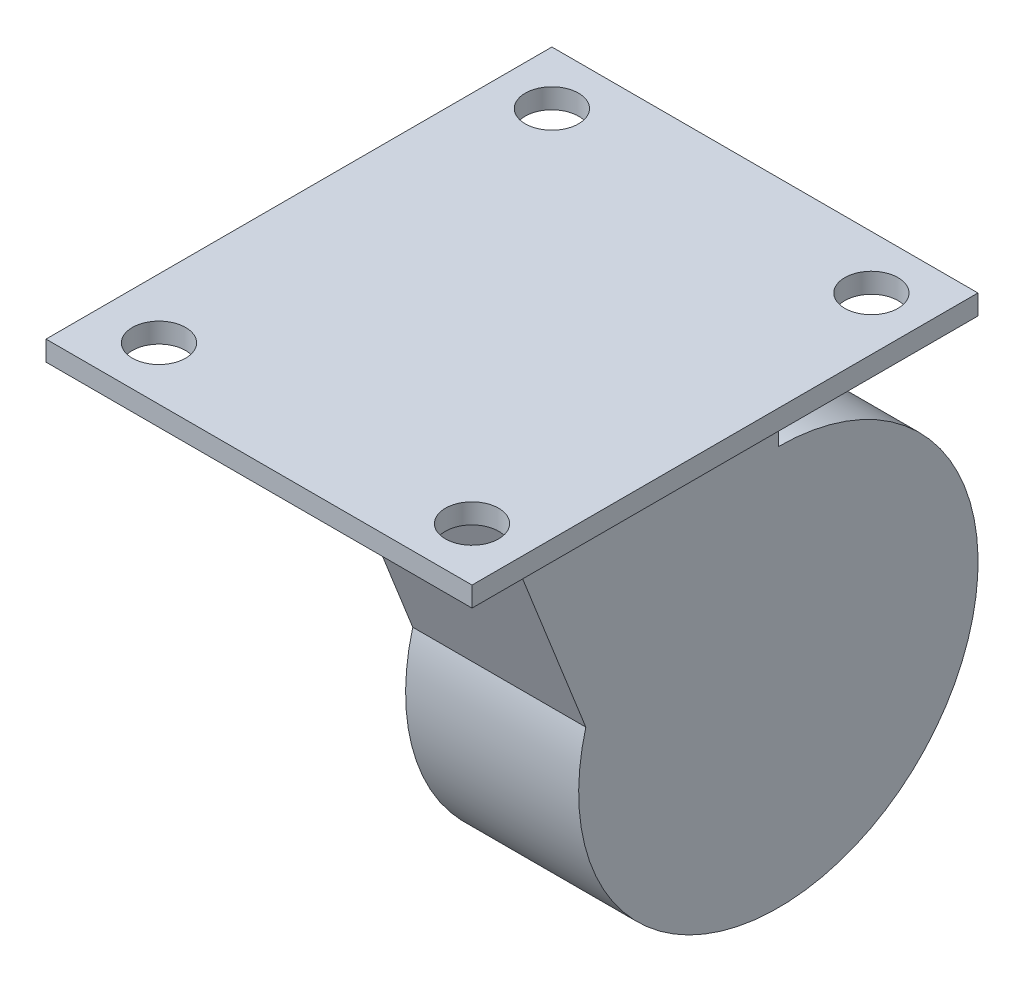
ISO-10303-21;
HEADER;
FILE_DESCRIPTION(('STEP AP214'),'2;1');
FILE_NAME('part.step','',(''),(''),'','','');
FILE_SCHEMA(('AUTOMOTIVE_DESIGN { 1 0 10303 214 1 1 1 1 }'));
ENDSEC;
DATA;
#1=APPLICATION_CONTEXT('core data for automotive mechanical design processes');
#2=APPLICATION_PROTOCOL_DEFINITION('international standard','automotive_design',2000,#1);
#3=PRODUCT_CONTEXT('',#1,'mechanical');
#4=PRODUCT('Part','Part','',(#3));
#5=PRODUCT_RELATED_PRODUCT_CATEGORY('part','',(#4));
#6=PRODUCT_DEFINITION_FORMATION('','',#4);
#7=PRODUCT_DEFINITION_CONTEXT('part definition',#1,'design');
#8=PRODUCT_DEFINITION('design','',#6,#7);
#9=PRODUCT_DEFINITION_SHAPE('','',#8);
#10=(LENGTH_UNIT() NAMED_UNIT(*) SI_UNIT(.MILLI.,.METRE.));
#11=(NAMED_UNIT(*) PLANE_ANGLE_UNIT() SI_UNIT($,.RADIAN.));
#12=(NAMED_UNIT(*) SI_UNIT($,.STERADIAN.) SOLID_ANGLE_UNIT());
#13=UNCERTAINTY_MEASURE_WITH_UNIT(LENGTH_MEASURE(1.E-05),#10,'distance_accuracy_value','');
#14=(GEOMETRIC_REPRESENTATION_CONTEXT(3) GLOBAL_UNCERTAINTY_ASSIGNED_CONTEXT((#13)) GLOBAL_UNIT_ASSIGNED_CONTEXT((#10,
#11,#12)) REPRESENTATION_CONTEXT('',''));
#15=CARTESIAN_POINT('',(0.,0.,0.));
#16=DIRECTION('',(0.,0.,1.));
#17=DIRECTION('',(1.,0.,0.));
#18=AXIS2_PLACEMENT_3D('',#15,#16,#17);
#19=CARTESIAN_POINT('',(0.,-1.5,0.));
#20=DIRECTION('',(0.,1.,0.));
#21=DIRECTION('',(0.,0.,1.));
#22=AXIS2_PLACEMENT_3D('',#19,#20,#21);
#23=PLANE('',#22);
#24=DIRECTION('',(0.,0.,1.));
#25=VECTOR('',#24,1.);
#26=CARTESIAN_POINT('',(-12.8229392993999,-1.5,-14.9558388081888));
#27=LINE('',#26,#25);
#28=CARTESIAN_POINT('',(-12.8229392993999,-1.5,-14.9558388081888));
#29=VERTEX_POINT('',#28);
#30=CARTESIAN_POINT('',(-12.8229392993999,-1.5,23.0441611918112));
#31=VERTEX_POINT('',#30);
#32=EDGE_CURVE('E171',#29,#31,#27,.T.);
#33=ORIENTED_EDGE('',*,*,#32,.F.);
#34=DIRECTION('',(-1.,0.,0.));
#35=VECTOR('',#34,1.);
#36=CARTESIAN_POINT('',(-12.8229392993999,-1.5,-14.9558388081888));
#37=LINE('',#36,#35);
#38=CARTESIAN_POINT('',(19.1770607006001,-1.5,-14.9558388081888));
#39=VERTEX_POINT('',#38);
#40=EDGE_CURVE('E179',#39,#29,#37,.T.);
#41=ORIENTED_EDGE('',*,*,#40,.F.);
#42=DIRECTION('',(0.,0.,-1.));
#43=VECTOR('',#42,1.);
#44=CARTESIAN_POINT('',(19.1770607006001,-1.5,-14.9558388081888));
#45=LINE('',#44,#43);
#46=CARTESIAN_POINT('',(19.1770607006001,-1.5,23.0441611918112));
#47=VERTEX_POINT('',#46);
#48=EDGE_CURVE('E176',#47,#39,#45,.T.);
#49=ORIENTED_EDGE('',*,*,#48,.F.);
#50=DIRECTION('',(1.,0.,0.));
#51=VECTOR('',#50,1.);
#52=CARTESIAN_POINT('',(-12.8229392993999,-1.5,23.0441611918112));
#53=LINE('',#52,#51);
#54=EDGE_CURVE('E173',#31,#47,#53,.T.);
#55=ORIENTED_EDGE('',*,*,#54,.F.);
#56=EDGE_LOOP('',(#33,#41,#49,#55));
#57=FACE_BOUND('',#56,.T.);
#58=CARTESIAN_POINT('',(-8.8229392993999,-1.5,-10.9558388081888));
#59=DIRECTION('',(0.,1.,0.));
#60=DIRECTION('',(0.,0.,1.));
#61=AXIS2_PLACEMENT_3D('',#58,#59,#60);
#62=CIRCLE('',#61,2.);
#63=CARTESIAN_POINT('',(-8.8229392993999,-1.5,-8.95583880818883));
#64=VERTEX_POINT('',#63);
#65=EDGE_CURVE('E165',#64,#64,#62,.T.);
#66=ORIENTED_EDGE('',*,*,#65,.T.);
#67=EDGE_LOOP('',(#66));
#68=FACE_BOUND('',#67,.T.);
#69=CARTESIAN_POINT('',(15.1770607006001,-1.5,-10.9558388081888));
#70=DIRECTION('',(0.,1.,0.));
#71=DIRECTION('',(0.,0.,1.));
#72=AXIS2_PLACEMENT_3D('',#69,#70,#71);
#73=CIRCLE('',#72,2.00000000000001);
#74=CARTESIAN_POINT('',(15.1770607006001,-1.5,-8.95583880818883));
#75=VERTEX_POINT('',#74);
#76=EDGE_CURVE('E159',#75,#75,#73,.T.);
#77=ORIENTED_EDGE('',*,*,#76,.T.);
#78=EDGE_LOOP('',(#77));
#79=FACE_BOUND('',#78,.T.);
#80=CARTESIAN_POINT('',(15.1770607006001,-1.5,19.0441611918112));
#81=DIRECTION('',(0.,1.,0.));
#82=DIRECTION('',(0.,0.,1.));
#83=AXIS2_PLACEMENT_3D('',#80,#81,#82);
#84=CIRCLE('',#83,2.00000000000001);
#85=CARTESIAN_POINT('',(15.1770607006001,-1.5,21.0441611918112));
#86=VERTEX_POINT('',#85);
#87=EDGE_CURVE('E153',#86,#86,#84,.T.);
#88=ORIENTED_EDGE('',*,*,#87,.T.);
#89=EDGE_LOOP('',(#88));
#90=FACE_BOUND('',#89,.T.);
#91=CARTESIAN_POINT('',(-8.33660745961774,-1.5,19.0441611918112));
#92=DIRECTION('',(0.,1.,0.));
#93=DIRECTION('',(0.,0.,1.));
#94=AXIS2_PLACEMENT_3D('',#91,#92,#93);
#95=CIRCLE('',#94,2.);
#96=CARTESIAN_POINT('',(-8.33660745961774,-1.5,21.0441611918112));
#97=VERTEX_POINT('',#96);
#98=EDGE_CURVE('E147',#97,#97,#95,.T.);
#99=ORIENTED_EDGE('',*,*,#98,.T.);
#100=EDGE_LOOP('',(#99));
#101=FACE_BOUND('',#100,.T.);
#102=DIRECTION('',(0.,0.,1.));
#103=VECTOR('',#102,1.);
#104=CARTESIAN_POINT('',(9.6770607006001,-1.5,0.));
#105=LINE('',#104,#103);
#106=CARTESIAN_POINT('',(9.6770607006001,-1.5,-9.46635307367223));
#107=VERTEX_POINT('',#106);
#108=CARTESIAN_POINT('',(9.6770607006001,-1.5,13.4942410044884));
#109=VERTEX_POINT('',#108);
#110=EDGE_CURVE('E136',#107,#109,#105,.T.);
#111=ORIENTED_EDGE('',*,*,#110,.F.);
#112=DIRECTION('',(-1.,0.,0.));
#113=VECTOR('',#112,1.);
#114=CARTESIAN_POINT('',(9.6770607006001,-1.5,-9.46635307367223));
#115=LINE('',#114,#113);
#116=CARTESIAN_POINT('',(-3.3229392993999,-1.5,-9.46635307367223));
#117=VERTEX_POINT('',#116);
#118=EDGE_CURVE('E143',#107,#117,#115,.T.);
#119=ORIENTED_EDGE('',*,*,#118,.T.);
#120=DIRECTION('',(0.,0.,1.));
#121=VECTOR('',#120,1.);
#122=CARTESIAN_POINT('',(-3.3229392993999,-1.5,0.));
#123=LINE('',#122,#121);
#124=CARTESIAN_POINT('',(-3.3229392993999,-1.5,13.4942410044884));
#125=VERTEX_POINT('',#124);
#126=EDGE_CURVE('E128',#117,#125,#123,.T.);
#127=ORIENTED_EDGE('',*,*,#126,.T.);
#128=DIRECTION('',(-1.,0.,0.));
#129=VECTOR('',#128,1.);
#130=CARTESIAN_POINT('',(9.6770607006001,-1.5,13.4942410044884));
#131=LINE('',#130,#129);
#132=EDGE_CURVE('E118',#109,#125,#131,.T.);
#133=ORIENTED_EDGE('',*,*,#132,.F.);
#134=EDGE_LOOP('',(#111,#119,#127,#133));
#135=FACE_BOUND('',#134,.T.);
#136=ADVANCED_FACE('F35',(#57,#68,#79,#90,#101,#135),#23,.F.);
#137=CARTESIAN_POINT('',(-12.8229392993999,-1.5,-14.9558388081888));
#138=DIRECTION('',(-1.,0.,0.));
#139=DIRECTION('',(0.,0.,1.));
#140=AXIS2_PLACEMENT_3D('',#137,#138,#139);
#141=PLANE('',#140);
#142=DIRECTION('',(0.,0.,1.));
#143=VECTOR('',#142,1.);
#144=CARTESIAN_POINT('',(-12.8229392993999,0.,-14.9558388081888));
#145=LINE('',#144,#143);
#146=CARTESIAN_POINT('',(-12.8229392993999,0.,-14.9558388081888));
#147=VERTEX_POINT('',#146);
#148=CARTESIAN_POINT('',(-12.8229392993999,0.,23.0441611918112));
#149=VERTEX_POINT('',#148);
#150=EDGE_CURVE('E168',#147,#149,#145,.T.);
#151=ORIENTED_EDGE('',*,*,#150,.F.);
#152=DIRECTION('',(0.,1.,0.));
#153=VECTOR('',#152,1.);
#154=CARTESIAN_POINT('',(-12.8229392993999,-1.5,-14.9558388081888));
#155=LINE('',#154,#153);
#156=EDGE_CURVE('E11',#29,#147,#155,.T.);
#157=ORIENTED_EDGE('',*,*,#156,.F.);
#158=ORIENTED_EDGE('',*,*,#32,.T.);
#159=DIRECTION('',(0.,1.,0.));
#160=VECTOR('',#159,1.);
#161=CARTESIAN_POINT('',(-12.8229392993999,-1.5,23.0441611918112));
#162=LINE('',#161,#160);
#163=EDGE_CURVE('E39',#31,#149,#162,.T.);
#164=ORIENTED_EDGE('',*,*,#163,.T.);
#165=EDGE_LOOP('',(#151,#157,#158,#164));
#166=FACE_BOUND('',#165,.T.);
#167=ADVANCED_FACE('F37',(#166),#141,.T.);
#168=CARTESIAN_POINT('',(-12.8229392993999,-1.5,-14.9558388081888));
#169=DIRECTION('',(0.,0.,-1.));
#170=DIRECTION('',(-1.,0.,0.));
#171=AXIS2_PLACEMENT_3D('',#168,#169,#170);
#172=PLANE('',#171);
#173=DIRECTION('',(-1.,0.,0.));
#174=VECTOR('',#173,1.);
#175=CARTESIAN_POINT('',(-12.8229392993999,0.,-14.9558388081888));
#176=LINE('',#175,#174);
#177=CARTESIAN_POINT('',(19.1770607006001,0.,-14.9558388081888));
#178=VERTEX_POINT('',#177);
#179=EDGE_CURVE('E174',#178,#147,#176,.T.);
#180=ORIENTED_EDGE('',*,*,#179,.F.);
#181=DIRECTION('',(0.,1.,0.));
#182=VECTOR('',#181,1.);
#183=CARTESIAN_POINT('',(19.1770607006001,-1.5,-14.9558388081888));
#184=LINE('',#183,#182);
#185=EDGE_CURVE('E44',#39,#178,#184,.T.);
#186=ORIENTED_EDGE('',*,*,#185,.F.);
#187=ORIENTED_EDGE('',*,*,#40,.T.);
#188=ORIENTED_EDGE('',*,*,#156,.T.);
#189=EDGE_LOOP('',(#180,#186,#187,#188));
#190=FACE_BOUND('',#189,.T.);
#191=ADVANCED_FACE('F196',(#190),#172,.T.);
#192=CARTESIAN_POINT('',(19.1770607006001,-1.5,-14.9558388081888));
#193=DIRECTION('',(1.,0.,0.));
#194=DIRECTION('',(0.,0.,-1.));
#195=AXIS2_PLACEMENT_3D('',#192,#193,#194);
#196=PLANE('',#195);
#197=DIRECTION('',(0.,0.,-1.));
#198=VECTOR('',#197,1.);
#199=CARTESIAN_POINT('',(19.1770607006001,0.,-14.9558388081888));
#200=LINE('',#199,#198);
#201=CARTESIAN_POINT('',(19.1770607006001,0.,23.0441611918112));
#202=VERTEX_POINT('',#201);
#203=EDGE_CURVE('E186',#202,#178,#200,.T.);
#204=ORIENTED_EDGE('',*,*,#203,.F.);
#205=DIRECTION('',(0.,1.,0.));
#206=VECTOR('',#205,1.);
#207=CARTESIAN_POINT('',(19.1770607006001,-1.5,23.0441611918112));
#208=LINE('',#207,#206);
#209=EDGE_CURVE('E191',#47,#202,#208,.T.);
#210=ORIENTED_EDGE('',*,*,#209,.F.);
#211=ORIENTED_EDGE('',*,*,#48,.T.);
#212=ORIENTED_EDGE('',*,*,#185,.T.);
#213=EDGE_LOOP('',(#204,#210,#211,#212));
#214=FACE_BOUND('',#213,.T.);
#215=ADVANCED_FACE('F200',(#214),#196,.T.);
#216=CARTESIAN_POINT('',(-12.8229392993999,-1.5,23.0441611918112));
#217=DIRECTION('',(0.,0.,1.));
#218=DIRECTION('',(1.,0.,0.));
#219=AXIS2_PLACEMENT_3D('',#216,#217,#218);
#220=PLANE('',#219);
#221=DIRECTION('',(1.,0.,0.));
#222=VECTOR('',#221,1.);
#223=CARTESIAN_POINT('',(-12.8229392993999,0.,23.0441611918112));
#224=LINE('',#223,#222);
#225=EDGE_CURVE('E183',#149,#202,#224,.T.);
#226=ORIENTED_EDGE('',*,*,#225,.F.);
#227=ORIENTED_EDGE('',*,*,#163,.F.);
#228=ORIENTED_EDGE('',*,*,#54,.T.);
#229=ORIENTED_EDGE('',*,*,#209,.T.);
#230=EDGE_LOOP('',(#226,#227,#228,#229));
#231=FACE_BOUND('',#230,.T.);
#232=ADVANCED_FACE('F193',(#231),#220,.T.);
#233=CARTESIAN_POINT('',(0.,0.,0.));
#234=DIRECTION('',(0.,1.,0.));
#235=DIRECTION('',(0.,0.,1.));
#236=AXIS2_PLACEMENT_3D('',#233,#234,#235);
#237=PLANE('',#236);
#238=CARTESIAN_POINT('',(-8.33660745961774,0.,19.0441611918112));
#239=DIRECTION('',(0.,1.,0.));
#240=DIRECTION('',(0.,0.,1.));
#241=AXIS2_PLACEMENT_3D('',#238,#239,#240);
#242=CIRCLE('',#241,2.);
#243=CARTESIAN_POINT('',(-8.33660745961774,0.,21.0441611918112));
#244=VERTEX_POINT('',#243);
#245=EDGE_CURVE('E142',#244,#244,#242,.T.);
#246=ORIENTED_EDGE('',*,*,#245,.F.);
#247=EDGE_LOOP('',(#246));
#248=FACE_BOUND('',#247,.T.);
#249=CARTESIAN_POINT('',(15.1770607006001,0.,19.0441611918112));
#250=DIRECTION('',(0.,1.,0.));
#251=DIRECTION('',(0.,0.,1.));
#252=AXIS2_PLACEMENT_3D('',#249,#250,#251);
#253=CIRCLE('',#252,2.00000000000001);
#254=CARTESIAN_POINT('',(15.1770607006001,0.,21.0441611918112));
#255=VERTEX_POINT('',#254);
#256=EDGE_CURVE('E150',#255,#255,#253,.T.);
#257=ORIENTED_EDGE('',*,*,#256,.F.);
#258=EDGE_LOOP('',(#257));
#259=FACE_BOUND('',#258,.T.);
#260=CARTESIAN_POINT('',(15.1770607006001,0.,-10.9558388081888));
#261=DIRECTION('',(0.,1.,0.));
#262=DIRECTION('',(0.,0.,1.));
#263=AXIS2_PLACEMENT_3D('',#260,#261,#262);
#264=CIRCLE('',#263,2.00000000000001);
#265=CARTESIAN_POINT('',(15.1770607006001,0.,-8.95583880818883));
#266=VERTEX_POINT('',#265);
#267=EDGE_CURVE('E156',#266,#266,#264,.T.);
#268=ORIENTED_EDGE('',*,*,#267,.F.);
#269=EDGE_LOOP('',(#268));
#270=FACE_BOUND('',#269,.T.);
#271=CARTESIAN_POINT('',(-8.8229392993999,0.,-10.9558388081888));
#272=DIRECTION('',(0.,1.,0.));
#273=DIRECTION('',(0.,0.,1.));
#274=AXIS2_PLACEMENT_3D('',#271,#272,#273);
#275=CIRCLE('',#274,2.);
#276=CARTESIAN_POINT('',(-8.8229392993999,0.,-8.95583880818883));
#277=VERTEX_POINT('',#276);
#278=EDGE_CURVE('E162',#277,#277,#275,.T.);
#279=ORIENTED_EDGE('',*,*,#278,.F.);
#280=EDGE_LOOP('',(#279));
#281=FACE_BOUND('',#280,.T.);
#282=ORIENTED_EDGE('',*,*,#150,.T.);
#283=ORIENTED_EDGE('',*,*,#225,.T.);
#284=ORIENTED_EDGE('',*,*,#203,.T.);
#285=ORIENTED_EDGE('',*,*,#179,.T.);
#286=EDGE_LOOP('',(#282,#283,#284,#285));
#287=FACE_BOUND('',#286,.T.);
#288=ADVANCED_FACE('F195',(#248,#259,#270,#281,#287),#237,.T.);
#289=CARTESIAN_POINT('',(-8.8229392993999,-1.5,-10.9558388081888));
#290=DIRECTION('',(0.,1.,0.));
#291=DIRECTION('',(0.,0.,1.));
#292=AXIS2_PLACEMENT_3D('',#289,#290,#291);
#293=CYLINDRICAL_SURFACE('',#292,2.);
#294=ORIENTED_EDGE('',*,*,#65,.F.);
#295=EDGE_LOOP('',(#294));
#296=FACE_BOUND('',#295,.T.);
#297=ORIENTED_EDGE('',*,*,#278,.T.);
#298=EDGE_LOOP('',(#297));
#299=FACE_BOUND('',#298,.T.);
#300=ADVANCED_FACE('F241',(#296,#299),#293,.F.);
#301=CARTESIAN_POINT('',(15.1770607006001,-1.5,-10.9558388081888));
#302=DIRECTION('',(0.,1.,0.));
#303=DIRECTION('',(0.,0.,1.));
#304=AXIS2_PLACEMENT_3D('',#301,#302,#303);
#305=CYLINDRICAL_SURFACE('',#304,2.00000000000001);
#306=ORIENTED_EDGE('',*,*,#76,.F.);
#307=EDGE_LOOP('',(#306));
#308=FACE_BOUND('',#307,.T.);
#309=ORIENTED_EDGE('',*,*,#267,.T.);
#310=EDGE_LOOP('',(#309));
#311=FACE_BOUND('',#310,.T.);
#312=ADVANCED_FACE('F237',(#308,#311),#305,.F.);
#313=CARTESIAN_POINT('',(15.1770607006001,-1.5,19.0441611918112));
#314=DIRECTION('',(0.,1.,0.));
#315=DIRECTION('',(0.,0.,1.));
#316=AXIS2_PLACEMENT_3D('',#313,#314,#315);
#317=CYLINDRICAL_SURFACE('',#316,2.00000000000001);
#318=ORIENTED_EDGE('',*,*,#87,.F.);
#319=EDGE_LOOP('',(#318));
#320=FACE_BOUND('',#319,.T.);
#321=ORIENTED_EDGE('',*,*,#256,.T.);
#322=EDGE_LOOP('',(#321));
#323=FACE_BOUND('',#322,.T.);
#324=ADVANCED_FACE('F233',(#320,#323),#317,.F.);
#325=CARTESIAN_POINT('',(-8.33660745961774,-1.5,19.0441611918112));
#326=DIRECTION('',(0.,1.,0.));
#327=DIRECTION('',(0.,0.,1.));
#328=AXIS2_PLACEMENT_3D('',#325,#326,#327);
#329=CYLINDRICAL_SURFACE('',#328,2.);
#330=ORIENTED_EDGE('',*,*,#98,.F.);
#331=EDGE_LOOP('',(#330));
#332=FACE_BOUND('',#331,.T.);
#333=ORIENTED_EDGE('',*,*,#245,.T.);
#334=EDGE_LOOP('',(#333));
#335=FACE_BOUND('',#334,.T.);
#336=ADVANCED_FACE('F226',(#332,#335),#329,.F.);
#337=CARTESIAN_POINT('',(9.6770607006001,-27.,-9.46635307367223));
#338=DIRECTION('',(-1.,0.,0.));
#339=DIRECTION('',(0.,0.,1.));
#340=AXIS2_PLACEMENT_3D('',#337,#338,#339);
#341=CYLINDRICAL_SURFACE('',#340,15.);
#342=DIRECTION('',(-1.,0.,0.));
#343=VECTOR('',#342,1.);
#344=CARTESIAN_POINT('',(9.6770607006001,-23.0181629425859,4.99549237039899));
#345=LINE('',#344,#343);
#346=CARTESIAN_POINT('',(9.6770607006001,-23.0181629425859,4.99549237039899));
#347=VERTEX_POINT('',#346);
#348=CARTESIAN_POINT('',(-3.3229392993999,-23.0181629425859,4.99549237039899));
#349=VERTEX_POINT('',#348);
#350=EDGE_CURVE('E111',#347,#349,#345,.T.);
#351=ORIENTED_EDGE('',*,*,#350,.T.);
#352=CARTESIAN_POINT('',(-3.3229392993999,-27.,-9.46635307367223));
#353=DIRECTION('',(-1.,0.,0.));
#354=DIRECTION('',(0.,0.,1.));
#355=AXIS2_PLACEMENT_3D('',#352,#353,#354);
#356=CIRCLE('',#355,15.);
#357=CARTESIAN_POINT('',(-3.3229392993999,-12.,-9.46635307367223));
#358=VERTEX_POINT('',#357);
#359=EDGE_CURVE('E113',#358,#349,#356,.T.);
#360=ORIENTED_EDGE('',*,*,#359,.F.);
#361=DIRECTION('',(-1.,0.,0.));
#362=VECTOR('',#361,1.);
#363=CARTESIAN_POINT('',(9.6770607006001,-12.,-9.46635307367223));
#364=LINE('',#363,#362);
#365=CARTESIAN_POINT('',(9.6770607006001,-12.,-9.46635307367223));
#366=VERTEX_POINT('',#365);
#367=EDGE_CURVE('E140',#366,#358,#364,.T.);
#368=ORIENTED_EDGE('',*,*,#367,.F.);
#369=CARTESIAN_POINT('',(9.6770607006001,-27.,-9.46635307367223));
#370=DIRECTION('',(-1.,0.,0.));
#371=DIRECTION('',(0.,0.,1.));
#372=AXIS2_PLACEMENT_3D('',#369,#370,#371);
#373=CIRCLE('',#372,15.);
#374=EDGE_CURVE('E115',#366,#347,#373,.T.);
#375=ORIENTED_EDGE('',*,*,#374,.T.);
#376=EDGE_LOOP('',(#351,#360,#368,#375));
#377=FACE_BOUND('',#376,.T.);
#378=ADVANCED_FACE('F112',(#377),#341,.T.);
#379=CARTESIAN_POINT('',(9.6770607006001,0.,-9.46635307367223));
#380=DIRECTION('',(0.,0.,-1.));
#381=DIRECTION('',(-1.,0.,0.));
#382=AXIS2_PLACEMENT_3D('',#379,#380,#381);
#383=PLANE('',#382);
#384=ORIENTED_EDGE('',*,*,#367,.T.);
#385=DIRECTION('',(0.,-1.,0.));
#386=VECTOR('',#385,1.);
#387=CARTESIAN_POINT('',(-3.3229392993999,0.,-9.46635307367223));
#388=LINE('',#387,#386);
#389=EDGE_CURVE('E123',#117,#358,#388,.T.);
#390=ORIENTED_EDGE('',*,*,#389,.F.);
#391=ORIENTED_EDGE('',*,*,#118,.F.);
#392=DIRECTION('',(0.,-1.,0.));
#393=VECTOR('',#392,1.);
#394=CARTESIAN_POINT('',(9.6770607006001,0.,-9.46635307367223));
#395=LINE('',#394,#393);
#396=EDGE_CURVE('E119',#107,#366,#395,.T.);
#397=ORIENTED_EDGE('',*,*,#396,.T.);
#398=EDGE_LOOP('',(#384,#390,#391,#397));
#399=FACE_BOUND('',#398,.T.);
#400=ADVANCED_FACE('F218',(#399),#383,.T.);
#401=CARTESIAN_POINT('',(9.6770607006001,-4.81286715279546,12.1858010012751));
#402=DIRECTION('',(0.,0.367343672258266,-0.930085279128646));
#403=DIRECTION('',(0.,0.930085279128646,0.367343672258266));
#404=AXIS2_PLACEMENT_3D('',#401,#402,#403);
#405=PLANE('',#404);
#406=ORIENTED_EDGE('',*,*,#132,.T.);
#407=DIRECTION('',(0.,-0.930085279128646,-0.367343672258266));
#408=VECTOR('',#407,1.);
#409=CARTESIAN_POINT('',(-3.3229392993999,-4.81286715279546,12.1858010012751));
#410=LINE('',#409,#408);
#411=EDGE_CURVE('E52',#125,#349,#410,.T.);
#412=ORIENTED_EDGE('',*,*,#411,.T.);
#413=ORIENTED_EDGE('',*,*,#350,.F.);
#414=DIRECTION('',(0.,-0.930085279128646,-0.367343672258266));
#415=VECTOR('',#414,1.);
#416=CARTESIAN_POINT('',(9.6770607006001,-4.81286715279546,12.1858010012751));
#417=LINE('',#416,#415);
#418=EDGE_CURVE('E134',#109,#347,#417,.T.);
#419=ORIENTED_EDGE('',*,*,#418,.F.);
#420=EDGE_LOOP('',(#406,#412,#413,#419));
#421=FACE_BOUND('',#420,.T.);
#422=ADVANCED_FACE('F125',(#421),#405,.F.);
#423=CARTESIAN_POINT('',(9.6770607006001,0.,0.));
#424=DIRECTION('',(-1.,0.,0.));
#425=DIRECTION('',(0.,0.,1.));
#426=AXIS2_PLACEMENT_3D('',#423,#424,#425);
#427=PLANE('',#426);
#428=ORIENTED_EDGE('',*,*,#374,.F.);
#429=ORIENTED_EDGE('',*,*,#396,.F.);
#430=ORIENTED_EDGE('',*,*,#110,.T.);
#431=ORIENTED_EDGE('',*,*,#418,.T.);
#432=EDGE_LOOP('',(#428,#429,#430,#431));
#433=FACE_BOUND('',#432,.T.);
#434=ADVANCED_FACE('F216',(#433),#427,.F.);
#435=CARTESIAN_POINT('',(-3.3229392993999,0.,0.));
#436=DIRECTION('',(-1.,0.,0.));
#437=DIRECTION('',(0.,0.,1.));
#438=AXIS2_PLACEMENT_3D('',#435,#436,#437);
#439=PLANE('',#438);
#440=ORIENTED_EDGE('',*,*,#359,.T.);
#441=ORIENTED_EDGE('',*,*,#411,.F.);
#442=ORIENTED_EDGE('',*,*,#126,.F.);
#443=ORIENTED_EDGE('',*,*,#389,.T.);
#444=EDGE_LOOP('',(#440,#441,#442,#443));
#445=FACE_BOUND('',#444,.T.);
#446=ADVANCED_FACE('F122',(#445),#439,.T.);
#447=CLOSED_SHELL('',(#136,#167,#191,#215,#232,#288,#300,#312,#324,#336,#378,#400,#422,#434,#446));
#448=MANIFOLD_SOLID_BREP('B2',#447);
#449=ADVANCED_BREP_SHAPE_REPRESENTATION('',(#18,#448),#14);
#450=SHAPE_DEFINITION_REPRESENTATION(#9,#449);
ENDSEC;
END-ISO-10303-21;
